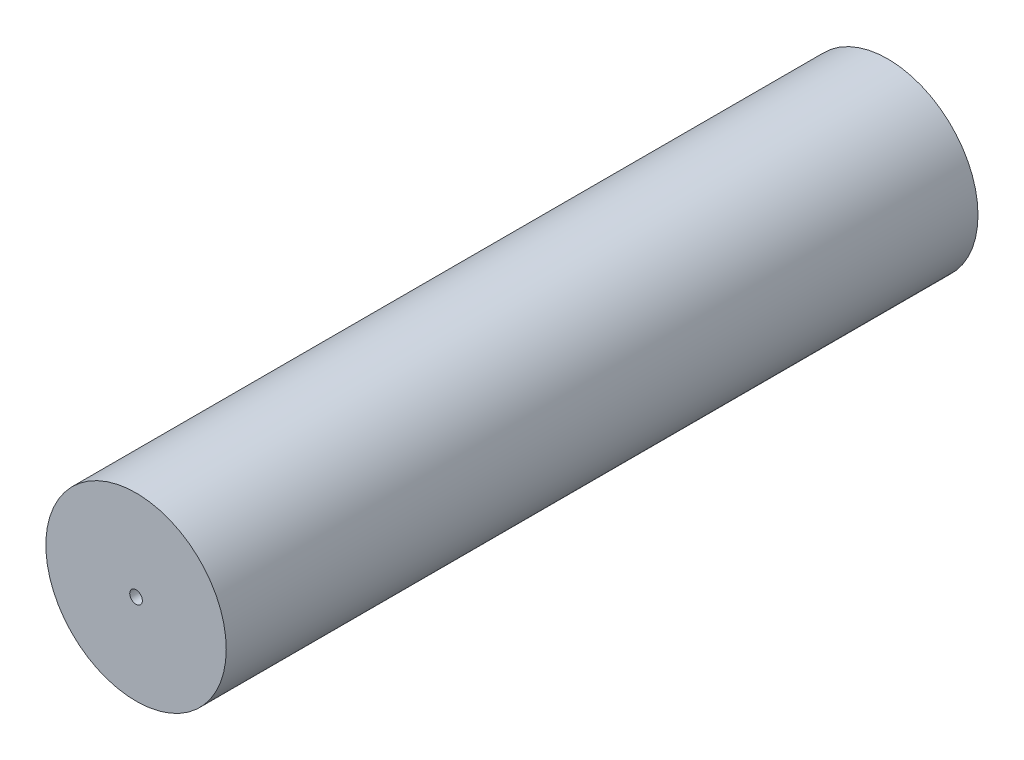
ISO-10303-21;
HEADER;
FILE_DESCRIPTION(('STEP AP214'),'2;1');
FILE_NAME('part.step','',(''),(''),'','','');
FILE_SCHEMA(('AUTOMOTIVE_DESIGN { 1 0 10303 214 1 1 1 1 }'));
ENDSEC;
DATA;
#1=APPLICATION_CONTEXT('core data for automotive mechanical design processes');
#2=APPLICATION_PROTOCOL_DEFINITION('international standard','automotive_design',2000,#1);
#3=PRODUCT_CONTEXT('',#1,'mechanical');
#4=PRODUCT('Part','Part','',(#3));
#5=PRODUCT_RELATED_PRODUCT_CATEGORY('part','',(#4));
#6=PRODUCT_DEFINITION_FORMATION('','',#4);
#7=PRODUCT_DEFINITION_CONTEXT('part definition',#1,'design');
#8=PRODUCT_DEFINITION('design','',#6,#7);
#9=PRODUCT_DEFINITION_SHAPE('','',#8);
#10=(LENGTH_UNIT() NAMED_UNIT(*) SI_UNIT(.MILLI.,.METRE.));
#11=(NAMED_UNIT(*) PLANE_ANGLE_UNIT() SI_UNIT($,.RADIAN.));
#12=(NAMED_UNIT(*) SI_UNIT($,.STERADIAN.) SOLID_ANGLE_UNIT());
#13=UNCERTAINTY_MEASURE_WITH_UNIT(LENGTH_MEASURE(1.E-05),#10,'distance_accuracy_value','');
#14=(GEOMETRIC_REPRESENTATION_CONTEXT(3) GLOBAL_UNCERTAINTY_ASSIGNED_CONTEXT((#13)) GLOBAL_UNIT_ASSIGNED_CONTEXT((#10,
#11,#12)) REPRESENTATION_CONTEXT('',''));
#15=CARTESIAN_POINT('',(0.,0.,0.));
#16=DIRECTION('',(0.,0.,1.));
#17=DIRECTION('',(1.,0.,0.));
#18=AXIS2_PLACEMENT_3D('',#15,#16,#17);
#19=CARTESIAN_POINT('',(0.,0.,250.));
#20=DIRECTION('',(0.,0.,-1.));
#21=DIRECTION('',(-1.,0.,0.));
#22=AXIS2_PLACEMENT_3D('',#19,#20,#21);
#23=CYLINDRICAL_SURFACE('',#22,30.);
#24=CARTESIAN_POINT('',(0.,0.,250.));
#25=DIRECTION('',(0.,0.,1.));
#26=DIRECTION('',(1.,0.,0.));
#27=AXIS2_PLACEMENT_3D('',#24,#25,#26);
#28=CIRCLE('',#27,30.);
#29=CARTESIAN_POINT('',(30.,0.,250.));
#30=VERTEX_POINT('',#29);
#31=EDGE_CURVE('E10',#30,#30,#28,.T.);
#32=ORIENTED_EDGE('',*,*,#31,.F.);
#33=EDGE_LOOP('',(#32));
#34=FACE_BOUND('',#33,.T.);
#35=CARTESIAN_POINT('',(0.,0.,0.));
#36=DIRECTION('',(0.,0.,1.));
#37=DIRECTION('',(1.,0.,0.));
#38=AXIS2_PLACEMENT_3D('',#35,#36,#37);
#39=CIRCLE('',#38,30.);
#40=CARTESIAN_POINT('',(30.,0.,0.));
#41=VERTEX_POINT('',#40);
#42=EDGE_CURVE('E46',#41,#41,#39,.T.);
#43=ORIENTED_EDGE('',*,*,#42,.T.);
#44=EDGE_LOOP('',(#43));
#45=FACE_BOUND('',#44,.T.);
#46=ADVANCED_FACE('F43',(#34,#45),#23,.T.);
#47=CARTESIAN_POINT('',(0.,0.,250.));
#48=DIRECTION('',(0.,0.,1.));
#49=DIRECTION('',(1.,0.,0.));
#50=AXIS2_PLACEMENT_3D('',#47,#48,#49);
#51=PLANE('',#50);
#52=CARTESIAN_POINT('',(0.,0.,250.));
#53=DIRECTION('',(0.,0.,1.));
#54=DIRECTION('',(1.,0.,0.));
#55=AXIS2_PLACEMENT_3D('',#52,#53,#54);
#56=CIRCLE('',#55,2.1);
#57=CARTESIAN_POINT('',(2.1,0.,250.));
#58=VERTEX_POINT('',#57);
#59=EDGE_CURVE('E57',#58,#58,#56,.T.);
#60=ORIENTED_EDGE('',*,*,#59,.F.);
#61=EDGE_LOOP('',(#60));
#62=FACE_BOUND('',#61,.T.);
#63=ORIENTED_EDGE('',*,*,#31,.T.);
#64=EDGE_LOOP('',(#63));
#65=FACE_BOUND('',#64,.T.);
#66=ADVANCED_FACE('F74',(#62,#65),#51,.T.);
#67=CARTESIAN_POINT('',(0.,0.,0.));
#68=DIRECTION('',(0.,0.,1.));
#69=DIRECTION('',(1.,0.,0.));
#70=AXIS2_PLACEMENT_3D('',#67,#68,#69);
#71=PLANE('',#70);
#72=CARTESIAN_POINT('',(0.,0.,0.));
#73=DIRECTION('',(0.,0.,1.));
#74=DIRECTION('',(1.,0.,0.));
#75=AXIS2_PLACEMENT_3D('',#72,#73,#74);
#76=CIRCLE('',#75,2.1);
#77=CARTESIAN_POINT('',(2.1,0.,0.));
#78=VERTEX_POINT('',#77);
#79=EDGE_CURVE('E55',#78,#78,#76,.T.);
#80=ORIENTED_EDGE('',*,*,#79,.T.);
#81=EDGE_LOOP('',(#80));
#82=FACE_BOUND('',#81,.T.);
#83=ORIENTED_EDGE('',*,*,#42,.F.);
#84=EDGE_LOOP('',(#83));
#85=FACE_BOUND('',#84,.T.);
#86=ADVANCED_FACE('F65',(#82,#85),#71,.F.);
#87=CARTESIAN_POINT('',(0.,0.,0.));
#88=DIRECTION('',(0.,0.,1.));
#89=DIRECTION('',(1.,0.,0.));
#90=AXIS2_PLACEMENT_3D('',#87,#88,#89);
#91=CYLINDRICAL_SURFACE('',#90,2.1);
#92=ORIENTED_EDGE('',*,*,#79,.F.);
#93=EDGE_LOOP('',(#92));
#94=FACE_BOUND('',#93,.T.);
#95=ORIENTED_EDGE('',*,*,#59,.T.);
#96=EDGE_LOOP('',(#95));
#97=FACE_BOUND('',#96,.T.);
#98=ADVANCED_FACE('F68',(#94,#97),#91,.F.);
#99=CLOSED_SHELL('',(#46,#66,#86,#98));
#100=MANIFOLD_SOLID_BREP('B2',#99);
#101=ADVANCED_BREP_SHAPE_REPRESENTATION('',(#18,#100),#14);
#102=SHAPE_DEFINITION_REPRESENTATION(#9,#101);
ENDSEC;
END-ISO-10303-21;
